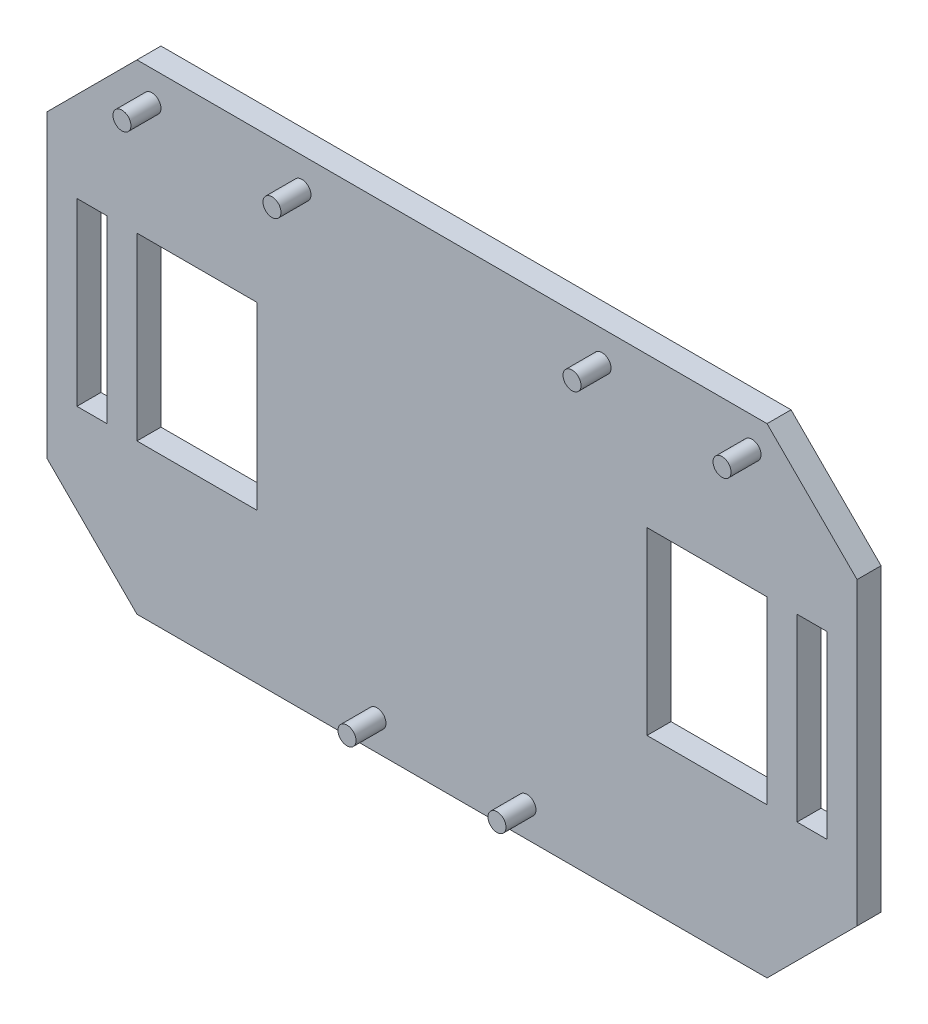
ISO-10303-21;
HEADER;
FILE_DESCRIPTION(('STEP AP214'),'2;1');
FILE_NAME('part.step','',(''),(''),'','','');
FILE_SCHEMA(('AUTOMOTIVE_DESIGN { 1 0 10303 214 1 1 1 1 }'));
ENDSEC;
DATA;
#1=APPLICATION_CONTEXT('core data for automotive mechanical design processes');
#2=APPLICATION_PROTOCOL_DEFINITION('international standard','automotive_design',2000,#1);
#3=PRODUCT_CONTEXT('',#1,'mechanical');
#4=PRODUCT('Part','Part','',(#3));
#5=PRODUCT_RELATED_PRODUCT_CATEGORY('part','',(#4));
#6=PRODUCT_DEFINITION_FORMATION('','',#4);
#7=PRODUCT_DEFINITION_CONTEXT('part definition',#1,'design');
#8=PRODUCT_DEFINITION('design','',#6,#7);
#9=PRODUCT_DEFINITION_SHAPE('','',#8);
#10=(LENGTH_UNIT() NAMED_UNIT(*) SI_UNIT(.MILLI.,.METRE.));
#11=(NAMED_UNIT(*) PLANE_ANGLE_UNIT() SI_UNIT($,.RADIAN.));
#12=(NAMED_UNIT(*) SI_UNIT($,.STERADIAN.) SOLID_ANGLE_UNIT());
#13=UNCERTAINTY_MEASURE_WITH_UNIT(LENGTH_MEASURE(1.E-05),#10,'distance_accuracy_value','');
#14=(GEOMETRIC_REPRESENTATION_CONTEXT(3) GLOBAL_UNCERTAINTY_ASSIGNED_CONTEXT((#13)) GLOBAL_UNIT_ASSIGNED_CONTEXT((#10,
#11,#12)) REPRESENTATION_CONTEXT('',''));
#15=CARTESIAN_POINT('',(0.,0.,0.));
#16=DIRECTION('',(0.,0.,1.));
#17=DIRECTION('',(1.,0.,0.));
#18=AXIS2_PLACEMENT_3D('',#15,#16,#17);
#19=CARTESIAN_POINT('',(0.,0.,8.));
#20=DIRECTION('',(1.,0.,0.));
#21=DIRECTION('',(0.,0.,-1.));
#22=AXIS2_PLACEMENT_3D('',#19,#20,#21);
#23=PLANE('',#22);
#24=DIRECTION('',(0.,-1.,0.));
#25=VECTOR('',#24,1.);
#26=CARTESIAN_POINT('',(0.,0.,0.));
#27=LINE('',#26,#25);
#28=CARTESIAN_POINT('',(0.,130.,0.));
#29=VERTEX_POINT('',#28);
#30=CARTESIAN_POINT('',(0.,30.0000000000001,0.));
#31=VERTEX_POINT('',#30);
#32=EDGE_CURVE('E324',#29,#31,#27,.T.);
#33=ORIENTED_EDGE('',*,*,#32,.T.);
#34=DIRECTION('',(0.,0.,1.));
#35=VECTOR('',#34,1.);
#36=CARTESIAN_POINT('',(0.,30.0000000000001,8.));
#37=LINE('',#36,#35);
#38=CARTESIAN_POINT('',(0.,30.0000000000001,8.));
#39=VERTEX_POINT('',#38);
#40=EDGE_CURVE('E388',#31,#39,#37,.T.);
#41=ORIENTED_EDGE('',*,*,#40,.T.);
#42=DIRECTION('',(0.,-1.,0.));
#43=VECTOR('',#42,1.);
#44=CARTESIAN_POINT('',(0.,0.,8.));
#45=LINE('',#44,#43);
#46=CARTESIAN_POINT('',(0.,130.,8.));
#47=VERTEX_POINT('',#46);
#48=EDGE_CURVE('E331',#47,#39,#45,.T.);
#49=ORIENTED_EDGE('',*,*,#48,.F.);
#50=DIRECTION('',(0.,0.,-1.));
#51=VECTOR('',#50,1.);
#52=CARTESIAN_POINT('',(0.,130.,8.));
#53=LINE('',#52,#51);
#54=EDGE_CURVE('E385',#47,#29,#53,.T.);
#55=ORIENTED_EDGE('',*,*,#54,.T.);
#56=EDGE_LOOP('',(#33,#41,#49,#55));
#57=FACE_BOUND('',#56,.T.);
#58=ADVANCED_FACE('F33',(#57),#23,.F.);
#59=CARTESIAN_POINT('',(0.,0.,8.));
#60=DIRECTION('',(0.,1.,0.));
#61=DIRECTION('',(0.,0.,1.));
#62=AXIS2_PLACEMENT_3D('',#59,#60,#61);
#63=PLANE('',#62);
#64=DIRECTION('',(1.,0.,0.));
#65=VECTOR('',#64,1.);
#66=CARTESIAN_POINT('',(0.,0.,0.));
#67=LINE('',#66,#65);
#68=CARTESIAN_POINT('',(30.,0.,0.));
#69=VERTEX_POINT('',#68);
#70=CARTESIAN_POINT('',(240.,0.,0.));
#71=VERTEX_POINT('',#70);
#72=EDGE_CURVE('E347',#69,#71,#67,.T.);
#73=ORIENTED_EDGE('',*,*,#72,.T.);
#74=DIRECTION('',(0.,0.,1.));
#75=VECTOR('',#74,1.);
#76=CARTESIAN_POINT('',(240.,0.,8.));
#77=LINE('',#76,#75);
#78=CARTESIAN_POINT('',(240.,0.,8.));
#79=VERTEX_POINT('',#78);
#80=EDGE_CURVE('E383',#71,#79,#77,.T.);
#81=ORIENTED_EDGE('',*,*,#80,.T.);
#82=DIRECTION('',(1.,0.,0.));
#83=VECTOR('',#82,1.);
#84=CARTESIAN_POINT('',(0.,0.,8.));
#85=LINE('',#84,#83);
#86=CARTESIAN_POINT('',(30.,0.,8.));
#87=VERTEX_POINT('',#86);
#88=EDGE_CURVE('E334',#87,#79,#85,.T.);
#89=ORIENTED_EDGE('',*,*,#88,.F.);
#90=DIRECTION('',(0.,0.,-1.));
#91=VECTOR('',#90,1.);
#92=CARTESIAN_POINT('',(30.,0.,8.));
#93=LINE('',#92,#91);
#94=EDGE_CURVE('E380',#87,#69,#93,.T.);
#95=ORIENTED_EDGE('',*,*,#94,.T.);
#96=EDGE_LOOP('',(#73,#81,#89,#95));
#97=FACE_BOUND('',#96,.T.);
#98=ADVANCED_FACE('F462',(#97),#63,.F.);
#99=CARTESIAN_POINT('',(270.,0.,8.));
#100=DIRECTION('',(-1.,0.,0.));
#101=DIRECTION('',(0.,0.,1.));
#102=AXIS2_PLACEMENT_3D('',#99,#100,#101);
#103=PLANE('',#102);
#104=DIRECTION('',(0.,1.,0.));
#105=VECTOR('',#104,1.);
#106=CARTESIAN_POINT('',(270.,0.,0.));
#107=LINE('',#106,#105);
#108=CARTESIAN_POINT('',(270.,30.,0.));
#109=VERTEX_POINT('',#108);
#110=CARTESIAN_POINT('',(270.,130.,0.));
#111=VERTEX_POINT('',#110);
#112=EDGE_CURVE('E350',#109,#111,#107,.T.);
#113=ORIENTED_EDGE('',*,*,#112,.T.);
#114=DIRECTION('',(0.,0.,1.));
#115=VECTOR('',#114,1.);
#116=CARTESIAN_POINT('',(270.,130.,8.));
#117=LINE('',#116,#115);
#118=CARTESIAN_POINT('',(270.,130.,8.));
#119=VERTEX_POINT('',#118);
#120=EDGE_CURVE('E370',#111,#119,#117,.T.);
#121=ORIENTED_EDGE('',*,*,#120,.T.);
#122=DIRECTION('',(0.,1.,0.));
#123=VECTOR('',#122,1.);
#124=CARTESIAN_POINT('',(270.,0.,8.));
#125=LINE('',#124,#123);
#126=CARTESIAN_POINT('',(270.,30.,8.));
#127=VERTEX_POINT('',#126);
#128=EDGE_CURVE('E338',#127,#119,#125,.T.);
#129=ORIENTED_EDGE('',*,*,#128,.F.);
#130=DIRECTION('',(0.,0.,-1.));
#131=VECTOR('',#130,1.);
#132=CARTESIAN_POINT('',(270.,30.,8.));
#133=LINE('',#132,#131);
#134=EDGE_CURVE('E367',#127,#109,#133,.T.);
#135=ORIENTED_EDGE('',*,*,#134,.T.);
#136=EDGE_LOOP('',(#113,#121,#129,#135));
#137=FACE_BOUND('',#136,.T.);
#138=ADVANCED_FACE('F466',(#137),#103,.F.);
#139=CARTESIAN_POINT('',(0.,160.,8.));
#140=DIRECTION('',(0.,-1.,0.));
#141=DIRECTION('',(0.,0.,-1.));
#142=AXIS2_PLACEMENT_3D('',#139,#140,#141);
#143=PLANE('',#142);
#144=DIRECTION('',(-1.,0.,0.));
#145=VECTOR('',#144,1.);
#146=CARTESIAN_POINT('',(0.,160.,8.));
#147=LINE('',#146,#145);
#148=CARTESIAN_POINT('',(240.,160.,8.));
#149=VERTEX_POINT('',#148);
#150=CARTESIAN_POINT('',(30.0000000000002,160.,8.));
#151=VERTEX_POINT('',#150);
#152=EDGE_CURVE('E341',#149,#151,#147,.T.);
#153=ORIENTED_EDGE('',*,*,#152,.F.);
#154=DIRECTION('',(0.,0.,-1.));
#155=VECTOR('',#154,1.);
#156=CARTESIAN_POINT('',(240.,160.,8.));
#157=LINE('',#156,#155);
#158=CARTESIAN_POINT('',(240.,160.,0.));
#159=VERTEX_POINT('',#158);
#160=EDGE_CURVE('E356',#149,#159,#157,.T.);
#161=ORIENTED_EDGE('',*,*,#160,.T.);
#162=DIRECTION('',(-1.,0.,0.));
#163=VECTOR('',#162,1.);
#164=CARTESIAN_POINT('',(0.,160.,0.));
#165=LINE('',#164,#163);
#166=CARTESIAN_POINT('',(30.0000000000002,160.,0.));
#167=VERTEX_POINT('',#166);
#168=EDGE_CURVE('E335',#159,#167,#165,.T.);
#169=ORIENTED_EDGE('',*,*,#168,.T.);
#170=DIRECTION('',(0.,0.,1.));
#171=VECTOR('',#170,1.);
#172=CARTESIAN_POINT('',(30.0000000000002,160.,8.));
#173=LINE('',#172,#171);
#174=EDGE_CURVE('E344',#167,#151,#173,.T.);
#175=ORIENTED_EDGE('',*,*,#174,.T.);
#176=EDGE_LOOP('',(#153,#161,#169,#175));
#177=FACE_BOUND('',#176,.T.);
#178=ADVANCED_FACE('F409',(#177),#143,.F.);
#179=CARTESIAN_POINT('',(0.,0.,8.));
#180=DIRECTION('',(0.,0.,-1.));
#181=DIRECTION('',(-1.,0.,0.));
#182=AXIS2_PLACEMENT_3D('',#179,#180,#181);
#183=PLANE('',#182);
#184=CARTESIAN_POINT('',(160.,10.,8.));
#185=DIRECTION('',(0.,0.,-1.));
#186=DIRECTION('',(-1.,0.,0.));
#187=AXIS2_PLACEMENT_3D('',#184,#185,#186);
#188=CIRCLE('',#187,2.99999999999999);
#189=CARTESIAN_POINT('',(157.,10.,8.));
#190=VERTEX_POINT('',#189);
#191=EDGE_CURVE('E11',#190,#190,#188,.F.);
#192=ORIENTED_EDGE('',*,*,#191,.F.);
#193=EDGE_LOOP('',(#192));
#194=FACE_BOUND('',#193,.T.);
#195=CARTESIAN_POINT('',(110.,10.,8.));
#196=DIRECTION('',(0.,0.,-1.));
#197=DIRECTION('',(-1.,0.,0.));
#198=AXIS2_PLACEMENT_3D('',#195,#196,#197);
#199=CIRCLE('',#198,3.00000000000001);
#200=CARTESIAN_POINT('',(107.,10.,8.));
#201=VERTEX_POINT('',#200);
#202=EDGE_CURVE('E41',#201,#201,#199,.F.);
#203=ORIENTED_EDGE('',*,*,#202,.F.);
#204=EDGE_LOOP('',(#203));
#205=FACE_BOUND('',#204,.T.);
#206=CARTESIAN_POINT('',(235.,150.,8.));
#207=DIRECTION('',(0.,0.,-1.));
#208=DIRECTION('',(-1.,0.,0.));
#209=AXIS2_PLACEMENT_3D('',#206,#207,#208);
#210=CIRCLE('',#209,2.99999999999997);
#211=CARTESIAN_POINT('',(232.,150.,8.));
#212=VERTEX_POINT('',#211);
#213=EDGE_CURVE('E399',#212,#212,#210,.F.);
#214=ORIENTED_EDGE('',*,*,#213,.F.);
#215=EDGE_LOOP('',(#214));
#216=FACE_BOUND('',#215,.T.);
#217=CARTESIAN_POINT('',(185.,150.,8.));
#218=DIRECTION('',(0.,0.,-1.));
#219=DIRECTION('',(-1.,0.,0.));
#220=AXIS2_PLACEMENT_3D('',#217,#218,#219);
#221=CIRCLE('',#220,2.99999999999999);
#222=CARTESIAN_POINT('',(182.,150.,8.));
#223=VERTEX_POINT('',#222);
#224=EDGE_CURVE('E396',#223,#223,#221,.F.);
#225=ORIENTED_EDGE('',*,*,#224,.F.);
#226=EDGE_LOOP('',(#225));
#227=FACE_BOUND('',#226,.T.);
#228=CARTESIAN_POINT('',(85.0000000000001,150.,8.));
#229=DIRECTION('',(0.,0.,-1.));
#230=DIRECTION('',(-1.,0.,0.));
#231=AXIS2_PLACEMENT_3D('',#228,#229,#230);
#232=CIRCLE('',#231,3.00000000000001);
#233=CARTESIAN_POINT('',(82.0000000000001,150.,8.));
#234=VERTEX_POINT('',#233);
#235=EDGE_CURVE('E393',#234,#234,#232,.F.);
#236=ORIENTED_EDGE('',*,*,#235,.F.);
#237=EDGE_LOOP('',(#236));
#238=FACE_BOUND('',#237,.T.);
#239=CARTESIAN_POINT('',(35.0000000000001,150.,8.));
#240=DIRECTION('',(0.,0.,-1.));
#241=DIRECTION('',(-1.,0.,0.));
#242=AXIS2_PLACEMENT_3D('',#239,#240,#241);
#243=CIRCLE('',#242,3.00000000000001);
#244=CARTESIAN_POINT('',(32.0000000000001,150.,8.));
#245=VERTEX_POINT('',#244);
#246=EDGE_CURVE('E390',#245,#245,#243,.F.);
#247=ORIENTED_EDGE('',*,*,#246,.F.);
#248=EDGE_LOOP('',(#247));
#249=FACE_BOUND('',#248,.T.);
#250=DIRECTION('',(0.,-1.,0.));
#251=VECTOR('',#250,1.);
#252=CARTESIAN_POINT('',(10.,110.,8.));
#253=LINE('',#252,#251);
#254=CARTESIAN_POINT('',(10.,110.,8.));
#255=VERTEX_POINT('',#254);
#256=CARTESIAN_POINT('',(10.,50.,8.));
#257=VERTEX_POINT('',#256);
#258=EDGE_CURVE('E227',#255,#257,#253,.T.);
#259=ORIENTED_EDGE('',*,*,#258,.F.);
#260=DIRECTION('',(-1.,0.,0.));
#261=VECTOR('',#260,1.);
#262=CARTESIAN_POINT('',(20.,110.,8.));
#263=LINE('',#262,#261);
#264=CARTESIAN_POINT('',(20.,110.,8.));
#265=VERTEX_POINT('',#264);
#266=EDGE_CURVE('E48',#265,#255,#263,.T.);
#267=ORIENTED_EDGE('',*,*,#266,.F.);
#268=DIRECTION('',(0.,1.,0.));
#269=VECTOR('',#268,1.);
#270=CARTESIAN_POINT('',(20.,50.,8.));
#271=LINE('',#270,#269);
#272=CARTESIAN_POINT('',(20.,50.,8.));
#273=VERTEX_POINT('',#272);
#274=EDGE_CURVE('E215',#273,#265,#271,.T.);
#275=ORIENTED_EDGE('',*,*,#274,.F.);
#276=DIRECTION('',(1.,0.,0.));
#277=VECTOR('',#276,1.);
#278=CARTESIAN_POINT('',(20.,50.,8.));
#279=LINE('',#278,#277);
#280=EDGE_CURVE('E218',#257,#273,#279,.T.);
#281=ORIENTED_EDGE('',*,*,#280,.F.);
#282=EDGE_LOOP('',(#259,#267,#275,#281));
#283=FACE_BOUND('',#282,.T.);
#284=DIRECTION('',(-1.,0.,0.));
#285=VECTOR('',#284,1.);
#286=CARTESIAN_POINT('',(240.,110.,8.));
#287=LINE('',#286,#285);
#288=CARTESIAN_POINT('',(240.,110.,8.));
#289=VERTEX_POINT('',#288);
#290=CARTESIAN_POINT('',(200.,110.,8.));
#291=VERTEX_POINT('',#290);
#292=EDGE_CURVE('E253',#289,#291,#287,.T.);
#293=ORIENTED_EDGE('',*,*,#292,.F.);
#294=DIRECTION('',(0.,1.,0.));
#295=VECTOR('',#294,1.);
#296=CARTESIAN_POINT('',(240.,50.,8.));
#297=LINE('',#296,#295);
#298=CARTESIAN_POINT('',(240.,50.,8.));
#299=VERTEX_POINT('',#298);
#300=EDGE_CURVE('E56',#299,#289,#297,.T.);
#301=ORIENTED_EDGE('',*,*,#300,.F.);
#302=DIRECTION('',(1.,0.,0.));
#303=VECTOR('',#302,1.);
#304=CARTESIAN_POINT('',(240.,50.,8.));
#305=LINE('',#304,#303);
#306=CARTESIAN_POINT('',(200.,50.,8.));
#307=VERTEX_POINT('',#306);
#308=EDGE_CURVE('E242',#307,#299,#305,.T.);
#309=ORIENTED_EDGE('',*,*,#308,.F.);
#310=DIRECTION('',(0.,-1.,0.));
#311=VECTOR('',#310,1.);
#312=CARTESIAN_POINT('',(200.,110.,8.));
#313=LINE('',#312,#311);
#314=EDGE_CURVE('E257',#291,#307,#313,.T.);
#315=ORIENTED_EDGE('',*,*,#314,.F.);
#316=EDGE_LOOP('',(#293,#301,#309,#315));
#317=FACE_BOUND('',#316,.T.);
#318=DIRECTION('',(1.,0.,0.));
#319=VECTOR('',#318,1.);
#320=CARTESIAN_POINT('',(250.,50.,8.));
#321=LINE('',#320,#319);
#322=CARTESIAN_POINT('',(250.,50.,8.));
#323=VERTEX_POINT('',#322);
#324=CARTESIAN_POINT('',(260.,50.,8.));
#325=VERTEX_POINT('',#324);
#326=EDGE_CURVE('E284',#323,#325,#321,.T.);
#327=ORIENTED_EDGE('',*,*,#326,.F.);
#328=DIRECTION('',(0.,-1.,0.));
#329=VECTOR('',#328,1.);
#330=CARTESIAN_POINT('',(250.,50.,8.));
#331=LINE('',#330,#329);
#332=CARTESIAN_POINT('',(250.,110.,8.));
#333=VERTEX_POINT('',#332);
#334=EDGE_CURVE('E282',#333,#323,#331,.T.);
#335=ORIENTED_EDGE('',*,*,#334,.F.);
#336=DIRECTION('',(-1.,0.,0.));
#337=VECTOR('',#336,1.);
#338=CARTESIAN_POINT('',(250.,110.,8.));
#339=LINE('',#338,#337);
#340=CARTESIAN_POINT('',(260.,110.,8.));
#341=VERTEX_POINT('',#340);
#342=EDGE_CURVE('E272',#341,#333,#339,.T.);
#343=ORIENTED_EDGE('',*,*,#342,.F.);
#344=DIRECTION('',(0.,1.,0.));
#345=VECTOR('',#344,1.);
#346=CARTESIAN_POINT('',(260.,110.,8.));
#347=LINE('',#346,#345);
#348=EDGE_CURVE('E287',#325,#341,#347,.T.);
#349=ORIENTED_EDGE('',*,*,#348,.F.);
#350=EDGE_LOOP('',(#327,#335,#343,#349));
#351=FACE_BOUND('',#350,.T.);
#352=DIRECTION('',(0.,-1.,0.));
#353=VECTOR('',#352,1.);
#354=CARTESIAN_POINT('',(30.,50.,8.));
#355=LINE('',#354,#353);
#356=CARTESIAN_POINT('',(30.,110.,8.));
#357=VERTEX_POINT('',#356);
#358=CARTESIAN_POINT('',(30.,50.,8.));
#359=VERTEX_POINT('',#358);
#360=EDGE_CURVE('E314',#357,#359,#355,.T.);
#361=ORIENTED_EDGE('',*,*,#360,.F.);
#362=DIRECTION('',(-1.,0.,0.));
#363=VECTOR('',#362,1.);
#364=CARTESIAN_POINT('',(30.,110.,8.));
#365=LINE('',#364,#363);
#366=CARTESIAN_POINT('',(70.,110.,8.));
#367=VERTEX_POINT('',#366);
#368=EDGE_CURVE('E234',#367,#357,#365,.T.);
#369=ORIENTED_EDGE('',*,*,#368,.F.);
#370=DIRECTION('',(0.,1.,0.));
#371=VECTOR('',#370,1.);
#372=CARTESIAN_POINT('',(70.,110.,8.));
#373=LINE('',#372,#371);
#374=CARTESIAN_POINT('',(70.,50.,8.));
#375=VERTEX_POINT('',#374);
#376=EDGE_CURVE('E303',#375,#367,#373,.T.);
#377=ORIENTED_EDGE('',*,*,#376,.F.);
#378=DIRECTION('',(1.,0.,0.));
#379=VECTOR('',#378,1.);
#380=CARTESIAN_POINT('',(30.,50.,8.));
#381=LINE('',#380,#379);
#382=EDGE_CURVE('E317',#359,#375,#381,.T.);
#383=ORIENTED_EDGE('',*,*,#382,.F.);
#384=EDGE_LOOP('',(#361,#369,#377,#383));
#385=FACE_BOUND('',#384,.T.);
#386=ORIENTED_EDGE('',*,*,#128,.T.);
#387=DIRECTION('',(0.707106781186546,-0.707106781186549,0.));
#388=VECTOR('',#387,1.);
#389=CARTESIAN_POINT('',(240.,160.,8.));
#390=LINE('',#389,#388);
#391=EDGE_CURVE('E378',#119,#149,#390,.F.);
#392=ORIENTED_EDGE('',*,*,#391,.T.);
#393=ORIENTED_EDGE('',*,*,#152,.T.);
#394=DIRECTION('',(0.70710678118655,0.707106781186546,0.));
#395=VECTOR('',#394,1.);
#396=CARTESIAN_POINT('',(0.,130.,8.));
#397=LINE('',#396,#395);
#398=EDGE_CURVE('E372',#151,#47,#397,.F.);
#399=ORIENTED_EDGE('',*,*,#398,.T.);
#400=ORIENTED_EDGE('',*,*,#48,.T.);
#401=DIRECTION('',(-0.707106781186546,0.707106781186549,0.));
#402=VECTOR('',#401,1.);
#403=CARTESIAN_POINT('',(30.,0.,8.));
#404=LINE('',#403,#402);
#405=EDGE_CURVE('E374',#39,#87,#404,.F.);
#406=ORIENTED_EDGE('',*,*,#405,.T.);
#407=ORIENTED_EDGE('',*,*,#88,.T.);
#408=DIRECTION('',(-0.707106781186549,-0.707106781186546,0.));
#409=VECTOR('',#408,1.);
#410=CARTESIAN_POINT('',(270.,30.,8.));
#411=LINE('',#410,#409);
#412=EDGE_CURVE('E376',#79,#127,#411,.F.);
#413=ORIENTED_EDGE('',*,*,#412,.T.);
#414=EDGE_LOOP('',(#386,#392,#393,#399,#400,#406,#407,#413));
#415=FACE_BOUND('',#414,.T.);
#416=ADVANCED_FACE('F406',(#194,#205,#216,#227,#238,#249,#283,#317,#351,#385,#415),#183,.F.);
#417=CARTESIAN_POINT('',(0.,0.,0.));
#418=DIRECTION('',(0.,0.,-1.));
#419=DIRECTION('',(-1.,0.,0.));
#420=AXIS2_PLACEMENT_3D('',#417,#418,#419);
#421=PLANE('',#420);
#422=DIRECTION('',(-1.,0.,0.));
#423=VECTOR('',#422,1.);
#424=CARTESIAN_POINT('',(20.,110.,0.));
#425=LINE('',#424,#423);
#426=CARTESIAN_POINT('',(20.,110.,0.));
#427=VERTEX_POINT('',#426);
#428=CARTESIAN_POINT('',(10.,110.,0.));
#429=VERTEX_POINT('',#428);
#430=EDGE_CURVE('E196',#427,#429,#425,.T.);
#431=ORIENTED_EDGE('',*,*,#430,.T.);
#432=DIRECTION('',(0.,-1.,0.));
#433=VECTOR('',#432,1.);
#434=CARTESIAN_POINT('',(10.,110.,0.));
#435=LINE('',#434,#433);
#436=CARTESIAN_POINT('',(10.,50.,0.));
#437=VERTEX_POINT('',#436);
#438=EDGE_CURVE('E206',#429,#437,#435,.T.);
#439=ORIENTED_EDGE('',*,*,#438,.T.);
#440=DIRECTION('',(1.,0.,0.));
#441=VECTOR('',#440,1.);
#442=CARTESIAN_POINT('',(20.,50.,0.));
#443=LINE('',#442,#441);
#444=CARTESIAN_POINT('',(20.,50.,0.));
#445=VERTEX_POINT('',#444);
#446=EDGE_CURVE('E210',#437,#445,#443,.T.);
#447=ORIENTED_EDGE('',*,*,#446,.T.);
#448=DIRECTION('',(0.,1.,0.));
#449=VECTOR('',#448,1.);
#450=CARTESIAN_POINT('',(20.,50.,0.));
#451=LINE('',#450,#449);
#452=EDGE_CURVE('E202',#445,#427,#451,.T.);
#453=ORIENTED_EDGE('',*,*,#452,.T.);
#454=EDGE_LOOP('',(#431,#439,#447,#453));
#455=FACE_BOUND('',#454,.T.);
#456=DIRECTION('',(0.,1.,0.));
#457=VECTOR('',#456,1.);
#458=CARTESIAN_POINT('',(240.,50.,0.));
#459=LINE('',#458,#457);
#460=CARTESIAN_POINT('',(240.,50.,0.));
#461=VERTEX_POINT('',#460);
#462=CARTESIAN_POINT('',(240.,110.,0.));
#463=VERTEX_POINT('',#462);
#464=EDGE_CURVE('E238',#461,#463,#459,.T.);
#465=ORIENTED_EDGE('',*,*,#464,.T.);
#466=DIRECTION('',(-1.,0.,0.));
#467=VECTOR('',#466,1.);
#468=CARTESIAN_POINT('',(240.,110.,0.));
#469=LINE('',#468,#467);
#470=CARTESIAN_POINT('',(200.,110.,0.));
#471=VERTEX_POINT('',#470);
#472=EDGE_CURVE('E241',#463,#471,#469,.T.);
#473=ORIENTED_EDGE('',*,*,#472,.T.);
#474=DIRECTION('',(0.,-1.,0.));
#475=VECTOR('',#474,1.);
#476=CARTESIAN_POINT('',(200.,110.,0.));
#477=LINE('',#476,#475);
#478=CARTESIAN_POINT('',(200.,50.,0.));
#479=VERTEX_POINT('',#478);
#480=EDGE_CURVE('E245',#471,#479,#477,.T.);
#481=ORIENTED_EDGE('',*,*,#480,.T.);
#482=DIRECTION('',(1.,0.,0.));
#483=VECTOR('',#482,1.);
#484=CARTESIAN_POINT('',(240.,50.,0.));
#485=LINE('',#484,#483);
#486=EDGE_CURVE('E248',#479,#461,#485,.T.);
#487=ORIENTED_EDGE('',*,*,#486,.T.);
#488=EDGE_LOOP('',(#465,#473,#481,#487));
#489=FACE_BOUND('',#488,.T.);
#490=DIRECTION('',(0.,-1.,0.));
#491=VECTOR('',#490,1.);
#492=CARTESIAN_POINT('',(250.,50.,0.));
#493=LINE('',#492,#491);
#494=CARTESIAN_POINT('',(250.,110.,0.));
#495=VERTEX_POINT('',#494);
#496=CARTESIAN_POINT('',(250.,50.,0.));
#497=VERTEX_POINT('',#496);
#498=EDGE_CURVE('E268',#495,#497,#493,.T.);
#499=ORIENTED_EDGE('',*,*,#498,.T.);
#500=DIRECTION('',(1.,0.,0.));
#501=VECTOR('',#500,1.);
#502=CARTESIAN_POINT('',(250.,50.,0.));
#503=LINE('',#502,#501);
#504=CARTESIAN_POINT('',(260.,50.,0.));
#505=VERTEX_POINT('',#504);
#506=EDGE_CURVE('E271',#497,#505,#503,.T.);
#507=ORIENTED_EDGE('',*,*,#506,.T.);
#508=DIRECTION('',(0.,1.,0.));
#509=VECTOR('',#508,1.);
#510=CARTESIAN_POINT('',(260.,110.,0.));
#511=LINE('',#510,#509);
#512=CARTESIAN_POINT('',(260.,110.,0.));
#513=VERTEX_POINT('',#512);
#514=EDGE_CURVE('E275',#505,#513,#511,.T.);
#515=ORIENTED_EDGE('',*,*,#514,.T.);
#516=DIRECTION('',(-1.,0.,0.));
#517=VECTOR('',#516,1.);
#518=CARTESIAN_POINT('',(250.,110.,0.));
#519=LINE('',#518,#517);
#520=EDGE_CURVE('E278',#513,#495,#519,.T.);
#521=ORIENTED_EDGE('',*,*,#520,.T.);
#522=EDGE_LOOP('',(#499,#507,#515,#521));
#523=FACE_BOUND('',#522,.T.);
#524=DIRECTION('',(-1.,0.,0.));
#525=VECTOR('',#524,1.);
#526=CARTESIAN_POINT('',(30.,110.,0.));
#527=LINE('',#526,#525);
#528=CARTESIAN_POINT('',(70.,110.,0.));
#529=VERTEX_POINT('',#528);
#530=CARTESIAN_POINT('',(30.,110.,0.));
#531=VERTEX_POINT('',#530);
#532=EDGE_CURVE('E299',#529,#531,#527,.T.);
#533=ORIENTED_EDGE('',*,*,#532,.T.);
#534=DIRECTION('',(0.,-1.,0.));
#535=VECTOR('',#534,1.);
#536=CARTESIAN_POINT('',(30.,50.,0.));
#537=LINE('',#536,#535);
#538=CARTESIAN_POINT('',(30.,50.,0.));
#539=VERTEX_POINT('',#538);
#540=EDGE_CURVE('E302',#531,#539,#537,.T.);
#541=ORIENTED_EDGE('',*,*,#540,.T.);
#542=DIRECTION('',(1.,0.,0.));
#543=VECTOR('',#542,1.);
#544=CARTESIAN_POINT('',(30.,50.,0.));
#545=LINE('',#544,#543);
#546=CARTESIAN_POINT('',(70.,50.,0.));
#547=VERTEX_POINT('',#546);
#548=EDGE_CURVE('E306',#539,#547,#545,.T.);
#549=ORIENTED_EDGE('',*,*,#548,.T.);
#550=DIRECTION('',(0.,1.,0.));
#551=VECTOR('',#550,1.);
#552=CARTESIAN_POINT('',(70.,110.,0.));
#553=LINE('',#552,#551);
#554=EDGE_CURVE('E309',#547,#529,#553,.T.);
#555=ORIENTED_EDGE('',*,*,#554,.T.);
#556=EDGE_LOOP('',(#533,#541,#549,#555));
#557=FACE_BOUND('',#556,.T.);
#558=ORIENTED_EDGE('',*,*,#168,.F.);
#559=DIRECTION('',(-0.707106781186546,0.707106781186549,0.));
#560=VECTOR('',#559,1.);
#561=CARTESIAN_POINT('',(200.000000000001,200.,0.));
#562=LINE('',#561,#560);
#563=EDGE_CURVE('E365',#159,#111,#562,.F.);
#564=ORIENTED_EDGE('',*,*,#563,.T.);
#565=ORIENTED_EDGE('',*,*,#112,.F.);
#566=DIRECTION('',(0.707106781186549,0.707106781186546,0.));
#567=VECTOR('',#566,1.);
#568=CARTESIAN_POINT('',(120.,-120.,0.));
#569=LINE('',#568,#567);
#570=EDGE_CURVE('E363',#109,#71,#569,.F.);
#571=ORIENTED_EDGE('',*,*,#570,.T.);
#572=ORIENTED_EDGE('',*,*,#72,.F.);
#573=DIRECTION('',(0.707106781186546,-0.707106781186549,0.));
#574=VECTOR('',#573,1.);
#575=CARTESIAN_POINT('',(15.0000000000001,15.,0.));
#576=LINE('',#575,#574);
#577=EDGE_CURVE('E361',#69,#31,#576,.F.);
#578=ORIENTED_EDGE('',*,*,#577,.T.);
#579=ORIENTED_EDGE('',*,*,#32,.F.);
#580=DIRECTION('',(-0.70710678118655,-0.707106781186546,0.));
#581=VECTOR('',#580,1.);
#582=CARTESIAN_POINT('',(-65.,65.0000000000004,0.));
#583=LINE('',#582,#581);
#584=EDGE_CURVE('E359',#29,#167,#583,.F.);
#585=ORIENTED_EDGE('',*,*,#584,.T.);
#586=EDGE_LOOP('',(#558,#564,#565,#571,#572,#578,#579,#585));
#587=FACE_BOUND('',#586,.T.);
#588=ADVANCED_FACE('F212',(#455,#489,#523,#557,#587),#421,.T.);
#589=CARTESIAN_POINT('',(240.,160.,8.));
#590=DIRECTION('',(-0.707106781186549,-0.707106781186546,0.));
#591=DIRECTION('',(0.,0.,-1.));
#592=AXIS2_PLACEMENT_3D('',#589,#590,#591);
#593=PLANE('',#592);
#594=ORIENTED_EDGE('',*,*,#391,.F.);
#595=ORIENTED_EDGE('',*,*,#120,.F.);
#596=ORIENTED_EDGE('',*,*,#563,.F.);
#597=ORIENTED_EDGE('',*,*,#160,.F.);
#598=EDGE_LOOP('',(#594,#595,#596,#597));
#599=FACE_BOUND('',#598,.T.);
#600=ADVANCED_FACE('F442',(#599),#593,.F.);
#601=CARTESIAN_POINT('',(270.,30.,8.));
#602=DIRECTION('',(-0.707106781186546,0.707106781186549,0.));
#603=DIRECTION('',(0.,0.,-1.));
#604=AXIS2_PLACEMENT_3D('',#601,#602,#603);
#605=PLANE('',#604);
#606=ORIENTED_EDGE('',*,*,#412,.F.);
#607=ORIENTED_EDGE('',*,*,#80,.F.);
#608=ORIENTED_EDGE('',*,*,#570,.F.);
#609=ORIENTED_EDGE('',*,*,#134,.F.);
#610=EDGE_LOOP('',(#606,#607,#608,#609));
#611=FACE_BOUND('',#610,.T.);
#612=ADVANCED_FACE('F465',(#611),#605,.F.);
#613=CARTESIAN_POINT('',(30.,0.,8.));
#614=DIRECTION('',(0.707106781186549,0.707106781186546,0.));
#615=DIRECTION('',(0.,0.,-1.));
#616=AXIS2_PLACEMENT_3D('',#613,#614,#615);
#617=PLANE('',#616);
#618=ORIENTED_EDGE('',*,*,#405,.F.);
#619=ORIENTED_EDGE('',*,*,#40,.F.);
#620=ORIENTED_EDGE('',*,*,#577,.F.);
#621=ORIENTED_EDGE('',*,*,#94,.F.);
#622=EDGE_LOOP('',(#618,#619,#620,#621));
#623=FACE_BOUND('',#622,.T.);
#624=ADVANCED_FACE('F459',(#623),#617,.F.);
#625=CARTESIAN_POINT('',(0.,130.,8.));
#626=DIRECTION('',(0.707106781186545,-0.707106781186549,0.));
#627=DIRECTION('',(0.,0.,-1.));
#628=AXIS2_PLACEMENT_3D('',#625,#626,#627);
#629=PLANE('',#628);
#630=ORIENTED_EDGE('',*,*,#398,.F.);
#631=ORIENTED_EDGE('',*,*,#174,.F.);
#632=ORIENTED_EDGE('',*,*,#584,.F.);
#633=ORIENTED_EDGE('',*,*,#54,.F.);
#634=EDGE_LOOP('',(#630,#631,#632,#633));
#635=FACE_BOUND('',#634,.T.);
#636=ADVANCED_FACE('F35',(#635),#629,.F.);
#637=CARTESIAN_POINT('',(30.,110.,0.));
#638=DIRECTION('',(0.,1.,0.));
#639=DIRECTION('',(0.,0.,1.));
#640=AXIS2_PLACEMENT_3D('',#637,#638,#639);
#641=PLANE('',#640);
#642=ORIENTED_EDGE('',*,*,#368,.T.);
#643=DIRECTION('',(0.,0.,1.));
#644=VECTOR('',#643,1.);
#645=CARTESIAN_POINT('',(30.,110.,0.));
#646=LINE('',#645,#644);
#647=EDGE_CURVE('E312',#531,#357,#646,.T.);
#648=ORIENTED_EDGE('',*,*,#647,.F.);
#649=ORIENTED_EDGE('',*,*,#532,.F.);
#650=DIRECTION('',(0.,0.,1.));
#651=VECTOR('',#650,1.);
#652=CARTESIAN_POINT('',(70.,110.,0.));
#653=LINE('',#652,#651);
#654=EDGE_CURVE('E322',#529,#367,#653,.T.);
#655=ORIENTED_EDGE('',*,*,#654,.T.);
#656=EDGE_LOOP('',(#642,#648,#649,#655));
#657=FACE_BOUND('',#656,.T.);
#658=ADVANCED_FACE('F487',(#657),#641,.F.);
#659=CARTESIAN_POINT('',(70.,110.,0.));
#660=DIRECTION('',(1.,0.,0.));
#661=DIRECTION('',(0.,0.,-1.));
#662=AXIS2_PLACEMENT_3D('',#659,#660,#661);
#663=PLANE('',#662);
#664=ORIENTED_EDGE('',*,*,#376,.T.);
#665=ORIENTED_EDGE('',*,*,#654,.F.);
#666=ORIENTED_EDGE('',*,*,#554,.F.);
#667=DIRECTION('',(0.,0.,1.));
#668=VECTOR('',#667,1.);
#669=CARTESIAN_POINT('',(70.,50.,0.));
#670=LINE('',#669,#668);
#671=EDGE_CURVE('E325',#547,#375,#670,.T.);
#672=ORIENTED_EDGE('',*,*,#671,.T.);
#673=EDGE_LOOP('',(#664,#665,#666,#672));
#674=FACE_BOUND('',#673,.T.);
#675=ADVANCED_FACE('F491',(#674),#663,.F.);
#676=CARTESIAN_POINT('',(30.,50.,0.));
#677=DIRECTION('',(0.,-1.,0.));
#678=DIRECTION('',(0.,0.,-1.));
#679=AXIS2_PLACEMENT_3D('',#676,#677,#678);
#680=PLANE('',#679);
#681=ORIENTED_EDGE('',*,*,#382,.T.);
#682=ORIENTED_EDGE('',*,*,#671,.F.);
#683=ORIENTED_EDGE('',*,*,#548,.F.);
#684=DIRECTION('',(0.,0.,1.));
#685=VECTOR('',#684,1.);
#686=CARTESIAN_POINT('',(30.,50.,0.));
#687=LINE('',#686,#685);
#688=EDGE_CURVE('E327',#539,#359,#687,.T.);
#689=ORIENTED_EDGE('',*,*,#688,.T.);
#690=EDGE_LOOP('',(#681,#682,#683,#689));
#691=FACE_BOUND('',#690,.T.);
#692=ADVANCED_FACE('F497',(#691),#680,.F.);
#693=CARTESIAN_POINT('',(30.,50.,0.));
#694=DIRECTION('',(-1.,0.,0.));
#695=DIRECTION('',(0.,0.,1.));
#696=AXIS2_PLACEMENT_3D('',#693,#694,#695);
#697=PLANE('',#696);
#698=ORIENTED_EDGE('',*,*,#360,.T.);
#699=ORIENTED_EDGE('',*,*,#688,.F.);
#700=ORIENTED_EDGE('',*,*,#540,.F.);
#701=ORIENTED_EDGE('',*,*,#647,.T.);
#702=EDGE_LOOP('',(#698,#699,#700,#701));
#703=FACE_BOUND('',#702,.T.);
#704=ADVANCED_FACE('F501',(#703),#697,.F.);
#705=CARTESIAN_POINT('',(250.,50.,0.));
#706=DIRECTION('',(-1.,0.,0.));
#707=DIRECTION('',(0.,0.,1.));
#708=AXIS2_PLACEMENT_3D('',#705,#706,#707);
#709=PLANE('',#708);
#710=ORIENTED_EDGE('',*,*,#334,.T.);
#711=DIRECTION('',(0.,0.,1.));
#712=VECTOR('',#711,1.);
#713=CARTESIAN_POINT('',(250.,50.,0.));
#714=LINE('',#713,#712);
#715=EDGE_CURVE('E281',#497,#323,#714,.T.);
#716=ORIENTED_EDGE('',*,*,#715,.F.);
#717=ORIENTED_EDGE('',*,*,#498,.F.);
#718=DIRECTION('',(0.,0.,1.));
#719=VECTOR('',#718,1.);
#720=CARTESIAN_POINT('',(250.,110.,0.));
#721=LINE('',#720,#719);
#722=EDGE_CURVE('E254',#495,#333,#721,.T.);
#723=ORIENTED_EDGE('',*,*,#722,.T.);
#724=EDGE_LOOP('',(#710,#716,#717,#723));
#725=FACE_BOUND('',#724,.T.);
#726=ADVANCED_FACE('F552',(#725),#709,.F.);
#727=CARTESIAN_POINT('',(250.,110.,0.));
#728=DIRECTION('',(0.,1.,0.));
#729=DIRECTION('',(0.,0.,1.));
#730=AXIS2_PLACEMENT_3D('',#727,#728,#729);
#731=PLANE('',#730);
#732=ORIENTED_EDGE('',*,*,#342,.T.);
#733=ORIENTED_EDGE('',*,*,#722,.F.);
#734=ORIENTED_EDGE('',*,*,#520,.F.);
#735=DIRECTION('',(0.,0.,1.));
#736=VECTOR('',#735,1.);
#737=CARTESIAN_POINT('',(260.,110.,0.));
#738=LINE('',#737,#736);
#739=EDGE_CURVE('E293',#513,#341,#738,.T.);
#740=ORIENTED_EDGE('',*,*,#739,.T.);
#741=EDGE_LOOP('',(#732,#733,#734,#740));
#742=FACE_BOUND('',#741,.T.);
#743=ADVANCED_FACE('F560',(#742),#731,.F.);
#744=CARTESIAN_POINT('',(260.,110.,0.));
#745=DIRECTION('',(1.,0.,0.));
#746=DIRECTION('',(0.,0.,-1.));
#747=AXIS2_PLACEMENT_3D('',#744,#745,#746);
#748=PLANE('',#747);
#749=ORIENTED_EDGE('',*,*,#348,.T.);
#750=ORIENTED_EDGE('',*,*,#739,.F.);
#751=ORIENTED_EDGE('',*,*,#514,.F.);
#752=DIRECTION('',(0.,0.,1.));
#753=VECTOR('',#752,1.);
#754=CARTESIAN_POINT('',(260.,50.,0.));
#755=LINE('',#754,#753);
#756=EDGE_CURVE('E295',#505,#325,#755,.T.);
#757=ORIENTED_EDGE('',*,*,#756,.T.);
#758=EDGE_LOOP('',(#749,#750,#751,#757));
#759=FACE_BOUND('',#758,.T.);
#760=ADVANCED_FACE('F569',(#759),#748,.F.);
#761=CARTESIAN_POINT('',(250.,50.,0.));
#762=DIRECTION('',(0.,-1.,0.));
#763=DIRECTION('',(0.,0.,-1.));
#764=AXIS2_PLACEMENT_3D('',#761,#762,#763);
#765=PLANE('',#764);
#766=ORIENTED_EDGE('',*,*,#326,.T.);
#767=ORIENTED_EDGE('',*,*,#756,.F.);
#768=ORIENTED_EDGE('',*,*,#506,.F.);
#769=ORIENTED_EDGE('',*,*,#715,.T.);
#770=EDGE_LOOP('',(#766,#767,#768,#769));
#771=FACE_BOUND('',#770,.T.);
#772=ADVANCED_FACE('F578',(#771),#765,.F.);
#773=CARTESIAN_POINT('',(240.,50.,0.));
#774=DIRECTION('',(1.,0.,0.));
#775=DIRECTION('',(0.,0.,-1.));
#776=AXIS2_PLACEMENT_3D('',#773,#774,#775);
#777=PLANE('',#776);
#778=ORIENTED_EDGE('',*,*,#300,.T.);
#779=DIRECTION('',(0.,0.,1.));
#780=VECTOR('',#779,1.);
#781=CARTESIAN_POINT('',(240.,110.,0.));
#782=LINE('',#781,#780);
#783=EDGE_CURVE('E251',#463,#289,#782,.T.);
#784=ORIENTED_EDGE('',*,*,#783,.F.);
#785=ORIENTED_EDGE('',*,*,#464,.F.);
#786=DIRECTION('',(0.,0.,1.));
#787=VECTOR('',#786,1.);
#788=CARTESIAN_POINT('',(240.,50.,0.));
#789=LINE('',#788,#787);
#790=EDGE_CURVE('E228',#461,#299,#789,.T.);
#791=ORIENTED_EDGE('',*,*,#790,.T.);
#792=EDGE_LOOP('',(#778,#784,#785,#791));
#793=FACE_BOUND('',#792,.T.);
#794=ADVANCED_FACE('F587',(#793),#777,.F.);
#795=CARTESIAN_POINT('',(240.,50.,0.));
#796=DIRECTION('',(0.,-1.,0.));
#797=DIRECTION('',(0.,0.,-1.));
#798=AXIS2_PLACEMENT_3D('',#795,#796,#797);
#799=PLANE('',#798);
#800=ORIENTED_EDGE('',*,*,#308,.T.);
#801=ORIENTED_EDGE('',*,*,#790,.F.);
#802=ORIENTED_EDGE('',*,*,#486,.F.);
#803=DIRECTION('',(0.,0.,1.));
#804=VECTOR('',#803,1.);
#805=CARTESIAN_POINT('',(200.,50.,0.));
#806=LINE('',#805,#804);
#807=EDGE_CURVE('E263',#479,#307,#806,.T.);
#808=ORIENTED_EDGE('',*,*,#807,.T.);
#809=EDGE_LOOP('',(#800,#801,#802,#808));
#810=FACE_BOUND('',#809,.T.);
#811=ADVANCED_FACE('F596',(#810),#799,.F.);
#812=CARTESIAN_POINT('',(200.,110.,0.));
#813=DIRECTION('',(-1.,0.,0.));
#814=DIRECTION('',(0.,0.,1.));
#815=AXIS2_PLACEMENT_3D('',#812,#813,#814);
#816=PLANE('',#815);
#817=ORIENTED_EDGE('',*,*,#314,.T.);
#818=ORIENTED_EDGE('',*,*,#807,.F.);
#819=ORIENTED_EDGE('',*,*,#480,.F.);
#820=DIRECTION('',(0.,0.,1.));
#821=VECTOR('',#820,1.);
#822=CARTESIAN_POINT('',(200.,110.,0.));
#823=LINE('',#822,#821);
#824=EDGE_CURVE('E265',#471,#291,#823,.T.);
#825=ORIENTED_EDGE('',*,*,#824,.T.);
#826=EDGE_LOOP('',(#817,#818,#819,#825));
#827=FACE_BOUND('',#826,.T.);
#828=ADVANCED_FACE('F604',(#827),#816,.F.);
#829=CARTESIAN_POINT('',(240.,110.,0.));
#830=DIRECTION('',(0.,1.,0.));
#831=DIRECTION('',(0.,0.,1.));
#832=AXIS2_PLACEMENT_3D('',#829,#830,#831);
#833=PLANE('',#832);
#834=ORIENTED_EDGE('',*,*,#292,.T.);
#835=ORIENTED_EDGE('',*,*,#824,.F.);
#836=ORIENTED_EDGE('',*,*,#472,.F.);
#837=ORIENTED_EDGE('',*,*,#783,.T.);
#838=EDGE_LOOP('',(#834,#835,#836,#837));
#839=FACE_BOUND('',#838,.T.);
#840=ADVANCED_FACE('F613',(#839),#833,.F.);
#841=CARTESIAN_POINT('',(20.,110.,0.));
#842=DIRECTION('',(0.,1.,0.));
#843=DIRECTION('',(0.,0.,1.));
#844=AXIS2_PLACEMENT_3D('',#841,#842,#843);
#845=PLANE('',#844);
#846=ORIENTED_EDGE('',*,*,#266,.T.);
#847=DIRECTION('',(0.,0.,1.));
#848=VECTOR('',#847,1.);
#849=CARTESIAN_POINT('',(10.,110.,0.));
#850=LINE('',#849,#848);
#851=EDGE_CURVE('E192',#429,#255,#850,.T.);
#852=ORIENTED_EDGE('',*,*,#851,.F.);
#853=ORIENTED_EDGE('',*,*,#430,.F.);
#854=DIRECTION('',(0.,0.,1.));
#855=VECTOR('',#854,1.);
#856=CARTESIAN_POINT('',(20.,110.,0.));
#857=LINE('',#856,#855);
#858=EDGE_CURVE('E232',#427,#265,#857,.T.);
#859=ORIENTED_EDGE('',*,*,#858,.T.);
#860=EDGE_LOOP('',(#846,#852,#853,#859));
#861=FACE_BOUND('',#860,.T.);
#862=ADVANCED_FACE('F194',(#861),#845,.F.);
#863=CARTESIAN_POINT('',(20.,50.,0.));
#864=DIRECTION('',(1.,0.,0.));
#865=DIRECTION('',(0.,0.,-1.));
#866=AXIS2_PLACEMENT_3D('',#863,#864,#865);
#867=PLANE('',#866);
#868=ORIENTED_EDGE('',*,*,#274,.T.);
#869=ORIENTED_EDGE('',*,*,#858,.F.);
#870=ORIENTED_EDGE('',*,*,#452,.F.);
#871=DIRECTION('',(0.,0.,1.));
#872=VECTOR('',#871,1.);
#873=CARTESIAN_POINT('',(20.,50.,0.));
#874=LINE('',#873,#872);
#875=EDGE_CURVE('E235',#445,#273,#874,.T.);
#876=ORIENTED_EDGE('',*,*,#875,.T.);
#877=EDGE_LOOP('',(#868,#869,#870,#876));
#878=FACE_BOUND('',#877,.T.);
#879=ADVANCED_FACE('F630',(#878),#867,.F.);
#880=CARTESIAN_POINT('',(20.,50.,0.));
#881=DIRECTION('',(0.,-1.,0.));
#882=DIRECTION('',(0.,0.,-1.));
#883=AXIS2_PLACEMENT_3D('',#880,#881,#882);
#884=PLANE('',#883);
#885=ORIENTED_EDGE('',*,*,#280,.T.);
#886=ORIENTED_EDGE('',*,*,#875,.F.);
#887=ORIENTED_EDGE('',*,*,#446,.F.);
#888=DIRECTION('',(0.,0.,1.));
#889=VECTOR('',#888,1.);
#890=CARTESIAN_POINT('',(10.,50.,0.));
#891=LINE('',#890,#889);
#892=EDGE_CURVE('E201',#437,#257,#891,.T.);
#893=ORIENTED_EDGE('',*,*,#892,.T.);
#894=EDGE_LOOP('',(#885,#886,#887,#893));
#895=FACE_BOUND('',#894,.T.);
#896=ADVANCED_FACE('F638',(#895),#884,.F.);
#897=CARTESIAN_POINT('',(10.,110.,0.));
#898=DIRECTION('',(-1.,0.,0.));
#899=DIRECTION('',(0.,0.,1.));
#900=AXIS2_PLACEMENT_3D('',#897,#898,#899);
#901=PLANE('',#900);
#902=ORIENTED_EDGE('',*,*,#258,.T.);
#903=ORIENTED_EDGE('',*,*,#892,.F.);
#904=ORIENTED_EDGE('',*,*,#438,.F.);
#905=ORIENTED_EDGE('',*,*,#851,.T.);
#906=EDGE_LOOP('',(#902,#903,#904,#905));
#907=FACE_BOUND('',#906,.T.);
#908=ADVANCED_FACE('F207',(#907),#901,.F.);
#909=CARTESIAN_POINT('',(35.0000000000001,150.,18.));
#910=DIRECTION('',(0.,0.,-1.));
#911=DIRECTION('',(-1.,0.,0.));
#912=AXIS2_PLACEMENT_3D('',#909,#910,#911);
#913=CYLINDRICAL_SURFACE('',#912,3.00000000000001);
#914=CARTESIAN_POINT('',(35.0000000000001,150.,18.));
#915=DIRECTION('',(0.,0.,1.));
#916=DIRECTION('',(1.,0.,0.));
#917=AXIS2_PLACEMENT_3D('',#914,#915,#916);
#918=CIRCLE('',#917,3.00000000000001);
#919=CARTESIAN_POINT('',(38.0000000000001,150.,18.));
#920=VERTEX_POINT('',#919);
#921=EDGE_CURVE('E221',#920,#920,#918,.T.);
#922=ORIENTED_EDGE('',*,*,#921,.F.);
#923=EDGE_LOOP('',(#922));
#924=FACE_BOUND('',#923,.T.);
#925=ORIENTED_EDGE('',*,*,#246,.T.);
#926=EDGE_LOOP('',(#925));
#927=FACE_BOUND('',#926,.T.);
#928=ADVANCED_FACE('F655',(#924,#927),#913,.T.);
#929=CARTESIAN_POINT('',(35.0000000000001,150.,18.));
#930=DIRECTION('',(0.,0.,1.));
#931=DIRECTION('',(1.,0.,0.));
#932=AXIS2_PLACEMENT_3D('',#929,#930,#931);
#933=PLANE('',#932);
#934=ORIENTED_EDGE('',*,*,#921,.T.);
#935=EDGE_LOOP('',(#934));
#936=FACE_BOUND('',#935,.T.);
#937=ADVANCED_FACE('F663',(#936),#933,.T.);
#938=CARTESIAN_POINT('',(85.0000000000001,150.,18.));
#939=DIRECTION('',(0.,0.,-1.));
#940=DIRECTION('',(-1.,0.,0.));
#941=AXIS2_PLACEMENT_3D('',#938,#939,#940);
#942=CYLINDRICAL_SURFACE('',#941,3.00000000000001);
#943=CARTESIAN_POINT('',(85.0000000000001,150.,18.));
#944=DIRECTION('',(0.,0.,1.));
#945=DIRECTION('',(1.,0.,0.));
#946=AXIS2_PLACEMENT_3D('',#943,#944,#945);
#947=CIRCLE('',#946,3.00000000000001);
#948=CARTESIAN_POINT('',(88.0000000000001,150.,18.));
#949=VERTEX_POINT('',#948);
#950=EDGE_CURVE('E803',#949,#949,#947,.T.);
#951=ORIENTED_EDGE('',*,*,#950,.F.);
#952=EDGE_LOOP('',(#951));
#953=FACE_BOUND('',#952,.T.);
#954=ORIENTED_EDGE('',*,*,#235,.T.);
#955=EDGE_LOOP('',(#954));
#956=FACE_BOUND('',#955,.T.);
#957=ADVANCED_FACE('F672',(#953,#956),#942,.T.);
#958=CARTESIAN_POINT('',(85.0000000000001,150.,18.));
#959=DIRECTION('',(0.,0.,1.));
#960=DIRECTION('',(1.,0.,0.));
#961=AXIS2_PLACEMENT_3D('',#958,#959,#960);
#962=PLANE('',#961);
#963=ORIENTED_EDGE('',*,*,#950,.T.);
#964=EDGE_LOOP('',(#963));
#965=FACE_BOUND('',#964,.T.);
#966=ADVANCED_FACE('F681',(#965),#962,.T.);
#967=CARTESIAN_POINT('',(185.,150.,18.));
#968=DIRECTION('',(0.,0.,-1.));
#969=DIRECTION('',(-1.,0.,0.));
#970=AXIS2_PLACEMENT_3D('',#967,#968,#969);
#971=CYLINDRICAL_SURFACE('',#970,2.99999999999999);
#972=CARTESIAN_POINT('',(185.,150.,18.));
#973=DIRECTION('',(0.,0.,1.));
#974=DIRECTION('',(-1.,0.,0.));
#975=AXIS2_PLACEMENT_3D('',#972,#973,#974);
#976=CIRCLE('',#975,2.99999999999999);
#977=CARTESIAN_POINT('',(182.,150.,18.));
#978=VERTEX_POINT('',#977);
#979=EDGE_CURVE('E801',#978,#978,#976,.T.);
#980=ORIENTED_EDGE('',*,*,#979,.F.);
#981=EDGE_LOOP('',(#980));
#982=FACE_BOUND('',#981,.T.);
#983=ORIENTED_EDGE('',*,*,#224,.T.);
#984=EDGE_LOOP('',(#983));
#985=FACE_BOUND('',#984,.T.);
#986=ADVANCED_FACE('F690',(#982,#985),#971,.T.);
#987=CARTESIAN_POINT('',(185.,150.,18.));
#988=DIRECTION('',(0.,0.,-1.));
#989=DIRECTION('',(-1.,0.,0.));
#990=AXIS2_PLACEMENT_3D('',#987,#988,#989);
#991=PLANE('',#990);
#992=ORIENTED_EDGE('',*,*,#979,.T.);
#993=EDGE_LOOP('',(#992));
#994=FACE_BOUND('',#993,.T.);
#995=ADVANCED_FACE('F699',(#994),#991,.F.);
#996=CARTESIAN_POINT('',(235.,150.,18.));
#997=DIRECTION('',(0.,0.,-1.));
#998=DIRECTION('',(-1.,0.,0.));
#999=AXIS2_PLACEMENT_3D('',#996,#997,#998);
#1000=CYLINDRICAL_SURFACE('',#999,2.99999999999997);
#1001=CARTESIAN_POINT('',(235.,150.,18.));
#1002=DIRECTION('',(0.,0.,1.));
#1003=DIRECTION('',(-1.,0.,0.));
#1004=AXIS2_PLACEMENT_3D('',#1001,#1002,#1003);
#1005=CIRCLE('',#1004,2.99999999999997);
#1006=CARTESIAN_POINT('',(232.,150.,18.));
#1007=VERTEX_POINT('',#1006);
#1008=EDGE_CURVE('E796',#1007,#1007,#1005,.T.);
#1009=ORIENTED_EDGE('',*,*,#1008,.F.);
#1010=EDGE_LOOP('',(#1009));
#1011=FACE_BOUND('',#1010,.T.);
#1012=ORIENTED_EDGE('',*,*,#213,.T.);
#1013=EDGE_LOOP('',(#1012));
#1014=FACE_BOUND('',#1013,.T.);
#1015=ADVANCED_FACE('F708',(#1011,#1014),#1000,.T.);
#1016=CARTESIAN_POINT('',(235.,150.,18.));
#1017=DIRECTION('',(0.,0.,-1.));
#1018=DIRECTION('',(-1.,0.,0.));
#1019=AXIS2_PLACEMENT_3D('',#1016,#1017,#1018);
#1020=PLANE('',#1019);
#1021=ORIENTED_EDGE('',*,*,#1008,.T.);
#1022=EDGE_LOOP('',(#1021));
#1023=FACE_BOUND('',#1022,.T.);
#1024=ADVANCED_FACE('F717',(#1023),#1020,.F.);
#1025=CARTESIAN_POINT('',(110.,10.,18.));
#1026=DIRECTION('',(0.,0.,-1.));
#1027=DIRECTION('',(-1.,0.,0.));
#1028=AXIS2_PLACEMENT_3D('',#1025,#1026,#1027);
#1029=CYLINDRICAL_SURFACE('',#1028,3.00000000000001);
#1030=CARTESIAN_POINT('',(110.,10.,18.));
#1031=DIRECTION('',(0.,0.,1.));
#1032=DIRECTION('',(1.,0.,0.));
#1033=AXIS2_PLACEMENT_3D('',#1030,#1031,#1032);
#1034=CIRCLE('',#1033,3.00000000000001);
#1035=CARTESIAN_POINT('',(113.,10.,18.));
#1036=VERTEX_POINT('',#1035);
#1037=EDGE_CURVE('E793',#1036,#1036,#1034,.T.);
#1038=ORIENTED_EDGE('',*,*,#1037,.F.);
#1039=EDGE_LOOP('',(#1038));
#1040=FACE_BOUND('',#1039,.T.);
#1041=ORIENTED_EDGE('',*,*,#202,.T.);
#1042=EDGE_LOOP('',(#1041));
#1043=FACE_BOUND('',#1042,.T.);
#1044=ADVANCED_FACE('F404',(#1040,#1043),#1029,.T.);
#1045=CARTESIAN_POINT('',(110.,10.,18.));
#1046=DIRECTION('',(0.,0.,1.));
#1047=DIRECTION('',(1.,0.,0.));
#1048=AXIS2_PLACEMENT_3D('',#1045,#1046,#1047);
#1049=PLANE('',#1048);
#1050=ORIENTED_EDGE('',*,*,#1037,.T.);
#1051=EDGE_LOOP('',(#1050));
#1052=FACE_BOUND('',#1051,.T.);
#1053=ADVANCED_FACE('F734',(#1052),#1049,.T.);
#1054=CARTESIAN_POINT('',(160.,10.,18.));
#1055=DIRECTION('',(0.,0.,-1.));
#1056=DIRECTION('',(-1.,0.,0.));
#1057=AXIS2_PLACEMENT_3D('',#1054,#1055,#1056);
#1058=CYLINDRICAL_SURFACE('',#1057,2.99999999999999);
#1059=CARTESIAN_POINT('',(160.,10.,18.));
#1060=DIRECTION('',(0.,0.,1.));
#1061=DIRECTION('',(-1.,0.,0.));
#1062=AXIS2_PLACEMENT_3D('',#1059,#1060,#1061);
#1063=CIRCLE('',#1062,2.99999999999999);
#1064=CARTESIAN_POINT('',(157.,10.,18.));
#1065=VERTEX_POINT('',#1064);
#1066=EDGE_CURVE('E792',#1065,#1065,#1063,.T.);
#1067=ORIENTED_EDGE('',*,*,#1066,.F.);
#1068=EDGE_LOOP('',(#1067));
#1069=FACE_BOUND('',#1068,.T.);
#1070=ORIENTED_EDGE('',*,*,#191,.T.);
#1071=EDGE_LOOP('',(#1070));
#1072=FACE_BOUND('',#1071,.T.);
#1073=ADVANCED_FACE('F743',(#1069,#1072),#1058,.T.);
#1074=CARTESIAN_POINT('',(160.,10.,18.));
#1075=DIRECTION('',(0.,0.,-1.));
#1076=DIRECTION('',(-1.,0.,0.));
#1077=AXIS2_PLACEMENT_3D('',#1074,#1075,#1076);
#1078=PLANE('',#1077);
#1079=ORIENTED_EDGE('',*,*,#1066,.T.);
#1080=EDGE_LOOP('',(#1079));
#1081=FACE_BOUND('',#1080,.T.);
#1082=ADVANCED_FACE('F752',(#1081),#1078,.F.);
#1083=CLOSED_SHELL('',(#58,#98,#138,#178,#416,#588,#600,#612,#624,#636,#658,#675,#692,#704,#726,
#743,#760,#772,#794,#811,#828,#840,#862,#879,#896,#908,#928,#937,#957,#966,#986,#995,#1015,
#1024,#1044,#1053,#1073,#1082));
#1084=MANIFOLD_SOLID_BREP('B2',#1083);
#1085=ADVANCED_BREP_SHAPE_REPRESENTATION('',(#18,#1084),#14);
#1086=SHAPE_DEFINITION_REPRESENTATION(#9,#1085);
ENDSEC;
END-ISO-10303-21;
